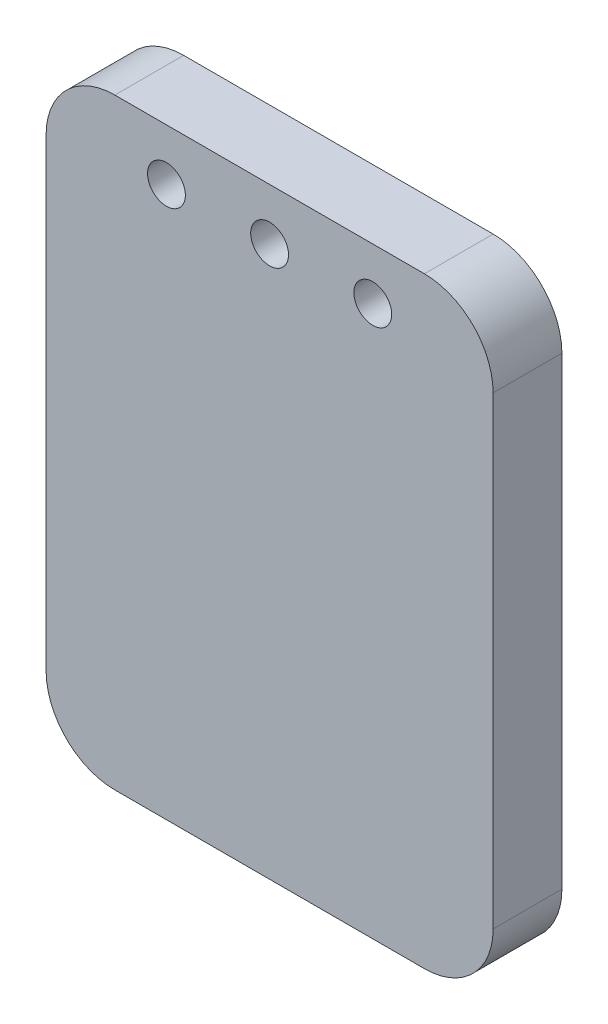
ISO-10303-21;
HEADER;
FILE_DESCRIPTION(('STEP AP214'),'2;1');
FILE_NAME('part.step','',(''),(''),'','','');
FILE_SCHEMA(('AUTOMOTIVE_DESIGN { 1 0 10303 214 1 1 1 1 }'));
ENDSEC;
DATA;
#1=APPLICATION_CONTEXT('core data for automotive mechanical design processes');
#2=APPLICATION_PROTOCOL_DEFINITION('international standard','automotive_design',2000,#1);
#3=PRODUCT_CONTEXT('',#1,'mechanical');
#4=PRODUCT('Part','Part','',(#3));
#5=PRODUCT_RELATED_PRODUCT_CATEGORY('part','',(#4));
#6=PRODUCT_DEFINITION_FORMATION('','',#4);
#7=PRODUCT_DEFINITION_CONTEXT('part definition',#1,'design');
#8=PRODUCT_DEFINITION('design','',#6,#7);
#9=PRODUCT_DEFINITION_SHAPE('','',#8);
#10=(LENGTH_UNIT() NAMED_UNIT(*) SI_UNIT(.MILLI.,.METRE.));
#11=(NAMED_UNIT(*) PLANE_ANGLE_UNIT() SI_UNIT($,.RADIAN.));
#12=(NAMED_UNIT(*) SI_UNIT($,.STERADIAN.) SOLID_ANGLE_UNIT());
#13=UNCERTAINTY_MEASURE_WITH_UNIT(LENGTH_MEASURE(1.E-05),#10,'distance_accuracy_value','');
#14=(GEOMETRIC_REPRESENTATION_CONTEXT(3) GLOBAL_UNCERTAINTY_ASSIGNED_CONTEXT((#13)) GLOBAL_UNIT_ASSIGNED_CONTEXT((#10,
#11,#12)) REPRESENTATION_CONTEXT('',''));
#15=CARTESIAN_POINT('',(0.,0.,0.));
#16=DIRECTION('',(0.,0.,1.));
#17=DIRECTION('',(1.,0.,0.));
#18=AXIS2_PLACEMENT_3D('',#15,#16,#17);
#19=CARTESIAN_POINT('',(0.,0.,10.));
#20=DIRECTION('',(0.,0.,1.));
#21=DIRECTION('',(1.,0.,0.));
#22=AXIS2_PLACEMENT_3D('',#19,#20,#21);
#23=PLANE('',#22);
#24=CARTESIAN_POINT('',(-15.,36.25,10.));
#25=DIRECTION('',(0.,0.,1.));
#26=DIRECTION('',(1.,0.,0.));
#27=AXIS2_PLACEMENT_3D('',#24,#25,#26);
#28=CIRCLE('',#27,2.75);
#29=CARTESIAN_POINT('',(-12.25,36.25,10.));
#30=VERTEX_POINT('',#29);
#31=EDGE_CURVE('E181',#30,#30,#28,.T.);
#32=ORIENTED_EDGE('',*,*,#31,.F.);
#33=EDGE_LOOP('',(#32));
#34=FACE_BOUND('',#33,.T.);
#35=DIRECTION('',(-1.,0.,0.));
#36=VECTOR('',#35,1.);
#37=CARTESIAN_POINT('',(-32.5,43.75,10.));
#38=LINE('',#37,#36);
#39=CARTESIAN_POINT('',(22.5,43.75,10.));
#40=VERTEX_POINT('',#39);
#41=CARTESIAN_POINT('',(-22.5,43.75,10.));
#42=VERTEX_POINT('',#41);
#43=EDGE_CURVE('E136',#40,#42,#38,.T.);
#44=ORIENTED_EDGE('',*,*,#43,.T.);
#45=CARTESIAN_POINT('',(-22.5,33.75,10.));
#46=DIRECTION('',(0.,0.,1.));
#47=DIRECTION('',(1.,0.,0.));
#48=AXIS2_PLACEMENT_3D('',#45,#46,#47);
#49=CIRCLE('',#48,10.);
#50=CARTESIAN_POINT('',(-32.5,33.75,10.));
#51=VERTEX_POINT('',#50);
#52=EDGE_CURVE('E155',#42,#51,#49,.T.);
#53=ORIENTED_EDGE('',*,*,#52,.T.);
#54=DIRECTION('',(0.,-1.,0.));
#55=VECTOR('',#54,1.);
#56=CARTESIAN_POINT('',(-32.5,43.75,10.));
#57=LINE('',#56,#55);
#58=CARTESIAN_POINT('',(-32.5,-33.75,10.));
#59=VERTEX_POINT('',#58);
#60=EDGE_CURVE('E119',#51,#59,#57,.T.);
#61=ORIENTED_EDGE('',*,*,#60,.T.);
#62=CARTESIAN_POINT('',(-22.5,-33.75,10.));
#63=DIRECTION('',(0.,0.,1.));
#64=DIRECTION('',(1.,0.,0.));
#65=AXIS2_PLACEMENT_3D('',#62,#63,#64);
#66=CIRCLE('',#65,10.);
#67=CARTESIAN_POINT('',(-22.5,-43.75,10.));
#68=VERTEX_POINT('',#67);
#69=EDGE_CURVE('E150',#59,#68,#66,.T.);
#70=ORIENTED_EDGE('',*,*,#69,.T.);
#71=DIRECTION('',(1.,0.,0.));
#72=VECTOR('',#71,1.);
#73=CARTESIAN_POINT('',(-32.5,-43.75,10.));
#74=LINE('',#73,#72);
#75=CARTESIAN_POINT('',(22.5,-43.75,10.));
#76=VERTEX_POINT('',#75);
#77=EDGE_CURVE('E166',#68,#76,#74,.T.);
#78=ORIENTED_EDGE('',*,*,#77,.T.);
#79=CARTESIAN_POINT('',(22.5,-33.75,10.));
#80=DIRECTION('',(0.,0.,1.));
#81=DIRECTION('',(1.,0.,0.));
#82=AXIS2_PLACEMENT_3D('',#79,#80,#81);
#83=CIRCLE('',#82,10.);
#84=CARTESIAN_POINT('',(32.5,-33.75,10.));
#85=VERTEX_POINT('',#84);
#86=EDGE_CURVE('E55',#76,#85,#83,.T.);
#87=ORIENTED_EDGE('',*,*,#86,.T.);
#88=DIRECTION('',(0.,1.,0.));
#89=VECTOR('',#88,1.);
#90=CARTESIAN_POINT('',(32.5,43.75,10.));
#91=LINE('',#90,#89);
#92=CARTESIAN_POINT('',(32.5,33.75,10.));
#93=VERTEX_POINT('',#92);
#94=EDGE_CURVE('E174',#85,#93,#91,.T.);
#95=ORIENTED_EDGE('',*,*,#94,.T.);
#96=CARTESIAN_POINT('',(22.5,33.75,10.));
#97=DIRECTION('',(0.,0.,1.));
#98=DIRECTION('',(1.,0.,0.));
#99=AXIS2_PLACEMENT_3D('',#96,#97,#98);
#100=CIRCLE('',#99,10.);
#101=EDGE_CURVE('E153',#93,#40,#100,.T.);
#102=ORIENTED_EDGE('',*,*,#101,.T.);
#103=EDGE_LOOP('',(#44,#53,#61,#70,#78,#87,#95,#102));
#104=FACE_BOUND('',#103,.T.);
#105=CARTESIAN_POINT('',(0.,36.25,10.));
#106=DIRECTION('',(0.,0.,1.));
#107=DIRECTION('',(1.,0.,0.));
#108=AXIS2_PLACEMENT_3D('',#105,#106,#107);
#109=CIRCLE('',#108,2.75);
#110=CARTESIAN_POINT('',(2.75,36.25,10.));
#111=VERTEX_POINT('',#110);
#112=EDGE_CURVE('E127',#111,#111,#109,.T.);
#113=ORIENTED_EDGE('',*,*,#112,.F.);
#114=EDGE_LOOP('',(#113));
#115=FACE_BOUND('',#114,.T.);
#116=CARTESIAN_POINT('',(15.,36.25,10.));
#117=DIRECTION('',(0.,0.,1.));
#118=DIRECTION('',(1.,0.,0.));
#119=AXIS2_PLACEMENT_3D('',#116,#117,#118);
#120=CIRCLE('',#119,2.75);
#121=CARTESIAN_POINT('',(17.75,36.25,10.));
#122=VERTEX_POINT('',#121);
#123=EDGE_CURVE('E186',#122,#122,#120,.T.);
#124=ORIENTED_EDGE('',*,*,#123,.F.);
#125=EDGE_LOOP('',(#124));
#126=FACE_BOUND('',#125,.T.);
#127=ADVANCED_FACE('F33',(#34,#104,#115,#126),#23,.T.);
#128=CARTESIAN_POINT('',(0.,0.,0.));
#129=DIRECTION('',(0.,0.,1.));
#130=DIRECTION('',(1.,0.,0.));
#131=AXIS2_PLACEMENT_3D('',#128,#129,#130);
#132=PLANE('',#131);
#133=DIRECTION('',(0.,-1.,0.));
#134=VECTOR('',#133,1.);
#135=CARTESIAN_POINT('',(-32.5,43.75,0.));
#136=LINE('',#135,#134);
#137=CARTESIAN_POINT('',(-32.5,33.75,0.));
#138=VERTEX_POINT('',#137);
#139=CARTESIAN_POINT('',(-32.5,-33.75,0.));
#140=VERTEX_POINT('',#139);
#141=EDGE_CURVE('E116',#138,#140,#136,.T.);
#142=ORIENTED_EDGE('',*,*,#141,.F.);
#143=CARTESIAN_POINT('',(-22.5,33.75,0.));
#144=DIRECTION('',(0.,0.,1.));
#145=DIRECTION('',(1.,0.,0.));
#146=AXIS2_PLACEMENT_3D('',#143,#144,#145);
#147=CIRCLE('',#146,10.);
#148=CARTESIAN_POINT('',(-22.5,43.75,0.));
#149=VERTEX_POINT('',#148);
#150=EDGE_CURVE('E99',#138,#149,#147,.F.);
#151=ORIENTED_EDGE('',*,*,#150,.T.);
#152=DIRECTION('',(-1.,0.,0.));
#153=VECTOR('',#152,1.);
#154=CARTESIAN_POINT('',(-32.5,43.75,0.));
#155=LINE('',#154,#153);
#156=CARTESIAN_POINT('',(22.5,43.75,0.));
#157=VERTEX_POINT('',#156);
#158=EDGE_CURVE('E140',#157,#149,#155,.T.);
#159=ORIENTED_EDGE('',*,*,#158,.F.);
#160=CARTESIAN_POINT('',(22.5,33.75,0.));
#161=DIRECTION('',(0.,0.,1.));
#162=DIRECTION('',(1.,0.,0.));
#163=AXIS2_PLACEMENT_3D('',#160,#161,#162);
#164=CIRCLE('',#163,10.);
#165=CARTESIAN_POINT('',(32.5,33.75,0.));
#166=VERTEX_POINT('',#165);
#167=EDGE_CURVE('E110',#157,#166,#164,.F.);
#168=ORIENTED_EDGE('',*,*,#167,.T.);
#169=DIRECTION('',(0.,1.,0.));
#170=VECTOR('',#169,1.);
#171=CARTESIAN_POINT('',(32.5,43.75,0.));
#172=LINE('',#171,#170);
#173=CARTESIAN_POINT('',(32.5,-33.75,0.));
#174=VERTEX_POINT('',#173);
#175=EDGE_CURVE('E130',#174,#166,#172,.T.);
#176=ORIENTED_EDGE('',*,*,#175,.F.);
#177=CARTESIAN_POINT('',(22.5,-33.75,0.));
#178=DIRECTION('',(0.,0.,1.));
#179=DIRECTION('',(1.,0.,0.));
#180=AXIS2_PLACEMENT_3D('',#177,#178,#179);
#181=CIRCLE('',#180,10.);
#182=CARTESIAN_POINT('',(22.5,-43.75,0.));
#183=VERTEX_POINT('',#182);
#184=EDGE_CURVE('E144',#174,#183,#181,.F.);
#185=ORIENTED_EDGE('',*,*,#184,.T.);
#186=DIRECTION('',(1.,0.,0.));
#187=VECTOR('',#186,1.);
#188=CARTESIAN_POINT('',(-32.5,-43.75,0.));
#189=LINE('',#188,#187);
#190=CARTESIAN_POINT('',(-22.5,-43.75,0.));
#191=VERTEX_POINT('',#190);
#192=EDGE_CURVE('E126',#191,#183,#189,.T.);
#193=ORIENTED_EDGE('',*,*,#192,.F.);
#194=CARTESIAN_POINT('',(-22.5,-33.75,0.));
#195=DIRECTION('',(0.,0.,1.));
#196=DIRECTION('',(1.,0.,0.));
#197=AXIS2_PLACEMENT_3D('',#194,#195,#196);
#198=CIRCLE('',#197,10.);
#199=EDGE_CURVE('E120',#191,#140,#198,.F.);
#200=ORIENTED_EDGE('',*,*,#199,.T.);
#201=EDGE_LOOP('',(#142,#151,#159,#168,#176,#185,#193,#200));
#202=FACE_BOUND('',#201,.T.);
#203=CARTESIAN_POINT('',(0.,36.25,0.));
#204=DIRECTION('',(0.,0.,1.));
#205=DIRECTION('',(1.,0.,0.));
#206=AXIS2_PLACEMENT_3D('',#203,#204,#205);
#207=CIRCLE('',#206,2.75);
#208=CARTESIAN_POINT('',(2.75,36.25,0.));
#209=VERTEX_POINT('',#208);
#210=EDGE_CURVE('E133',#209,#209,#207,.T.);
#211=ORIENTED_EDGE('',*,*,#210,.T.);
#212=EDGE_LOOP('',(#211));
#213=FACE_BOUND('',#212,.T.);
#214=CARTESIAN_POINT('',(-15.,36.25,0.));
#215=DIRECTION('',(0.,0.,1.));
#216=DIRECTION('',(1.,0.,0.));
#217=AXIS2_PLACEMENT_3D('',#214,#215,#216);
#218=CIRCLE('',#217,2.75);
#219=CARTESIAN_POINT('',(-12.25,36.25,0.));
#220=VERTEX_POINT('',#219);
#221=EDGE_CURVE('E183',#220,#220,#218,.T.);
#222=ORIENTED_EDGE('',*,*,#221,.T.);
#223=EDGE_LOOP('',(#222));
#224=FACE_BOUND('',#223,.T.);
#225=CARTESIAN_POINT('',(15.,36.25,0.));
#226=DIRECTION('',(0.,0.,1.));
#227=DIRECTION('',(1.,0.,0.));
#228=AXIS2_PLACEMENT_3D('',#225,#226,#227);
#229=CIRCLE('',#228,2.75);
#230=CARTESIAN_POINT('',(17.75,36.25,0.));
#231=VERTEX_POINT('',#230);
#232=EDGE_CURVE('E189',#231,#231,#229,.T.);
#233=ORIENTED_EDGE('',*,*,#232,.T.);
#234=EDGE_LOOP('',(#233));
#235=FACE_BOUND('',#234,.T.);
#236=ADVANCED_FACE('F123',(#202,#213,#224,#235),#132,.F.);
#237=CARTESIAN_POINT('',(-32.5,43.75,10.));
#238=DIRECTION('',(1.,0.,0.));
#239=DIRECTION('',(0.,1.,0.));
#240=AXIS2_PLACEMENT_3D('',#237,#238,#239);
#241=PLANE('',#240);
#242=ORIENTED_EDGE('',*,*,#60,.F.);
#243=DIRECTION('',(0.,0.,-1.));
#244=VECTOR('',#243,1.);
#245=CARTESIAN_POINT('',(-32.5,33.75,10.));
#246=LINE('',#245,#244);
#247=EDGE_CURVE('E103',#51,#138,#246,.T.);
#248=ORIENTED_EDGE('',*,*,#247,.T.);
#249=ORIENTED_EDGE('',*,*,#141,.T.);
#250=DIRECTION('',(0.,0.,-1.));
#251=VECTOR('',#250,1.);
#252=CARTESIAN_POINT('',(-32.5,-33.75,10.));
#253=LINE('',#252,#251);
#254=EDGE_CURVE('E121',#140,#59,#253,.F.);
#255=ORIENTED_EDGE('',*,*,#254,.T.);
#256=EDGE_LOOP('',(#242,#248,#249,#255));
#257=FACE_BOUND('',#256,.T.);
#258=ADVANCED_FACE('F115',(#257),#241,.F.);
#259=CARTESIAN_POINT('',(-32.5,-43.75,10.));
#260=DIRECTION('',(0.,1.,0.));
#261=DIRECTION('',(0.,0.,1.));
#262=AXIS2_PLACEMENT_3D('',#259,#260,#261);
#263=PLANE('',#262);
#264=ORIENTED_EDGE('',*,*,#192,.T.);
#265=DIRECTION('',(0.,0.,-1.));
#266=VECTOR('',#265,1.);
#267=CARTESIAN_POINT('',(22.5,-43.75,10.));
#268=LINE('',#267,#266);
#269=EDGE_CURVE('E11',#183,#76,#268,.F.);
#270=ORIENTED_EDGE('',*,*,#269,.T.);
#271=ORIENTED_EDGE('',*,*,#77,.F.);
#272=DIRECTION('',(0.,0.,-1.));
#273=VECTOR('',#272,1.);
#274=CARTESIAN_POINT('',(-22.5,-43.75,10.));
#275=LINE('',#274,#273);
#276=EDGE_CURVE('E41',#68,#191,#275,.T.);
#277=ORIENTED_EDGE('',*,*,#276,.T.);
#278=EDGE_LOOP('',(#264,#270,#271,#277));
#279=FACE_BOUND('',#278,.T.);
#280=ADVANCED_FACE('F164',(#279),#263,.F.);
#281=CARTESIAN_POINT('',(32.5,43.75,10.));
#282=DIRECTION('',(-1.,0.,0.));
#283=DIRECTION('',(0.,-1.,0.));
#284=AXIS2_PLACEMENT_3D('',#281,#282,#283);
#285=PLANE('',#284);
#286=ORIENTED_EDGE('',*,*,#175,.T.);
#287=DIRECTION('',(0.,0.,-1.));
#288=VECTOR('',#287,1.);
#289=CARTESIAN_POINT('',(32.5,33.75,10.));
#290=LINE('',#289,#288);
#291=EDGE_CURVE('E48',#166,#93,#290,.F.);
#292=ORIENTED_EDGE('',*,*,#291,.T.);
#293=ORIENTED_EDGE('',*,*,#94,.F.);
#294=DIRECTION('',(0.,0.,-1.));
#295=VECTOR('',#294,1.);
#296=CARTESIAN_POINT('',(32.5,-33.75,10.));
#297=LINE('',#296,#295);
#298=EDGE_CURVE('E157',#85,#174,#297,.T.);
#299=ORIENTED_EDGE('',*,*,#298,.T.);
#300=EDGE_LOOP('',(#286,#292,#293,#299));
#301=FACE_BOUND('',#300,.T.);
#302=ADVANCED_FACE('F173',(#301),#285,.F.);
#303=CARTESIAN_POINT('',(-32.5,43.75,10.));
#304=DIRECTION('',(0.,-1.,0.));
#305=DIRECTION('',(0.,0.,-1.));
#306=AXIS2_PLACEMENT_3D('',#303,#304,#305);
#307=PLANE('',#306);
#308=ORIENTED_EDGE('',*,*,#158,.T.);
#309=DIRECTION('',(0.,0.,-1.));
#310=VECTOR('',#309,1.);
#311=CARTESIAN_POINT('',(-22.5,43.75,10.));
#312=LINE('',#311,#310);
#313=EDGE_CURVE('E104',#149,#42,#312,.F.);
#314=ORIENTED_EDGE('',*,*,#313,.T.);
#315=ORIENTED_EDGE('',*,*,#43,.F.);
#316=DIRECTION('',(0.,0.,-1.));
#317=VECTOR('',#316,1.);
#318=CARTESIAN_POINT('',(22.5,43.75,10.));
#319=LINE('',#318,#317);
#320=EDGE_CURVE('E109',#40,#157,#319,.T.);
#321=ORIENTED_EDGE('',*,*,#320,.T.);
#322=EDGE_LOOP('',(#308,#314,#315,#321));
#323=FACE_BOUND('',#322,.T.);
#324=ADVANCED_FACE('F210',(#323),#307,.F.);
#325=CARTESIAN_POINT('',(0.,36.25,10.));
#326=DIRECTION('',(0.,0.,-1.));
#327=DIRECTION('',(-1.,0.,0.));
#328=AXIS2_PLACEMENT_3D('',#325,#326,#327);
#329=CYLINDRICAL_SURFACE('',#328,2.75);
#330=ORIENTED_EDGE('',*,*,#112,.T.);
#331=EDGE_LOOP('',(#330));
#332=FACE_BOUND('',#331,.T.);
#333=ORIENTED_EDGE('',*,*,#210,.F.);
#334=EDGE_LOOP('',(#333));
#335=FACE_BOUND('',#334,.T.);
#336=ADVANCED_FACE('F207',(#332,#335),#329,.F.);
#337=CARTESIAN_POINT('',(-15.,36.25,10.));
#338=DIRECTION('',(0.,0.,-1.));
#339=DIRECTION('',(-1.,0.,0.));
#340=AXIS2_PLACEMENT_3D('',#337,#338,#339);
#341=CYLINDRICAL_SURFACE('',#340,2.75);
#342=ORIENTED_EDGE('',*,*,#31,.T.);
#343=EDGE_LOOP('',(#342));
#344=FACE_BOUND('',#343,.T.);
#345=ORIENTED_EDGE('',*,*,#221,.F.);
#346=EDGE_LOOP('',(#345));
#347=FACE_BOUND('',#346,.T.);
#348=ADVANCED_FACE('F238',(#344,#347),#341,.F.);
#349=CARTESIAN_POINT('',(15.,36.25,10.));
#350=DIRECTION('',(0.,0.,-1.));
#351=DIRECTION('',(-1.,0.,0.));
#352=AXIS2_PLACEMENT_3D('',#349,#350,#351);
#353=CYLINDRICAL_SURFACE('',#352,2.75);
#354=ORIENTED_EDGE('',*,*,#123,.T.);
#355=EDGE_LOOP('',(#354));
#356=FACE_BOUND('',#355,.T.);
#357=ORIENTED_EDGE('',*,*,#232,.F.);
#358=EDGE_LOOP('',(#357));
#359=FACE_BOUND('',#358,.T.);
#360=ADVANCED_FACE('F195',(#356,#359),#353,.F.);
#361=CARTESIAN_POINT('',(-22.5,33.75,10.));
#362=DIRECTION('',(0.,0.,-1.));
#363=DIRECTION('',(-1.,0.,0.));
#364=AXIS2_PLACEMENT_3D('',#361,#362,#363);
#365=CYLINDRICAL_SURFACE('',#364,10.);
#366=ORIENTED_EDGE('',*,*,#52,.F.);
#367=ORIENTED_EDGE('',*,*,#313,.F.);
#368=ORIENTED_EDGE('',*,*,#150,.F.);
#369=ORIENTED_EDGE('',*,*,#247,.F.);
#370=EDGE_LOOP('',(#366,#367,#368,#369));
#371=FACE_BOUND('',#370,.T.);
#372=ADVANCED_FACE('F102',(#371),#365,.T.);
#373=CARTESIAN_POINT('',(22.5,33.75,10.));
#374=DIRECTION('',(0.,0.,-1.));
#375=DIRECTION('',(-1.,0.,0.));
#376=AXIS2_PLACEMENT_3D('',#373,#374,#375);
#377=CYLINDRICAL_SURFACE('',#376,10.);
#378=ORIENTED_EDGE('',*,*,#101,.F.);
#379=ORIENTED_EDGE('',*,*,#291,.F.);
#380=ORIENTED_EDGE('',*,*,#167,.F.);
#381=ORIENTED_EDGE('',*,*,#320,.F.);
#382=EDGE_LOOP('',(#378,#379,#380,#381));
#383=FACE_BOUND('',#382,.T.);
#384=ADVANCED_FACE('F222',(#383),#377,.T.);
#385=CARTESIAN_POINT('',(22.5,-33.75,10.));
#386=DIRECTION('',(0.,0.,-1.));
#387=DIRECTION('',(-1.,0.,0.));
#388=AXIS2_PLACEMENT_3D('',#385,#386,#387);
#389=CYLINDRICAL_SURFACE('',#388,10.);
#390=ORIENTED_EDGE('',*,*,#86,.F.);
#391=ORIENTED_EDGE('',*,*,#269,.F.);
#392=ORIENTED_EDGE('',*,*,#184,.F.);
#393=ORIENTED_EDGE('',*,*,#298,.F.);
#394=EDGE_LOOP('',(#390,#391,#392,#393));
#395=FACE_BOUND('',#394,.T.);
#396=ADVANCED_FACE('F172',(#395),#389,.T.);
#397=CARTESIAN_POINT('',(-22.5,-33.75,10.));
#398=DIRECTION('',(0.,0.,-1.));
#399=DIRECTION('',(-1.,0.,0.));
#400=AXIS2_PLACEMENT_3D('',#397,#398,#399);
#401=CYLINDRICAL_SURFACE('',#400,10.);
#402=ORIENTED_EDGE('',*,*,#69,.F.);
#403=ORIENTED_EDGE('',*,*,#254,.F.);
#404=ORIENTED_EDGE('',*,*,#199,.F.);
#405=ORIENTED_EDGE('',*,*,#276,.F.);
#406=EDGE_LOOP('',(#402,#403,#404,#405));
#407=FACE_BOUND('',#406,.T.);
#408=ADVANCED_FACE('F35',(#407),#401,.T.);
#409=CLOSED_SHELL('',(#127,#236,#258,#280,#302,#324,#336,#348,#360,#372,#384,#396,#408));
#410=MANIFOLD_SOLID_BREP('B2',#409);
#411=ADVANCED_BREP_SHAPE_REPRESENTATION('',(#18,#410),#14);
#412=SHAPE_DEFINITION_REPRESENTATION(#9,#411);
ENDSEC;
END-ISO-10303-21;
